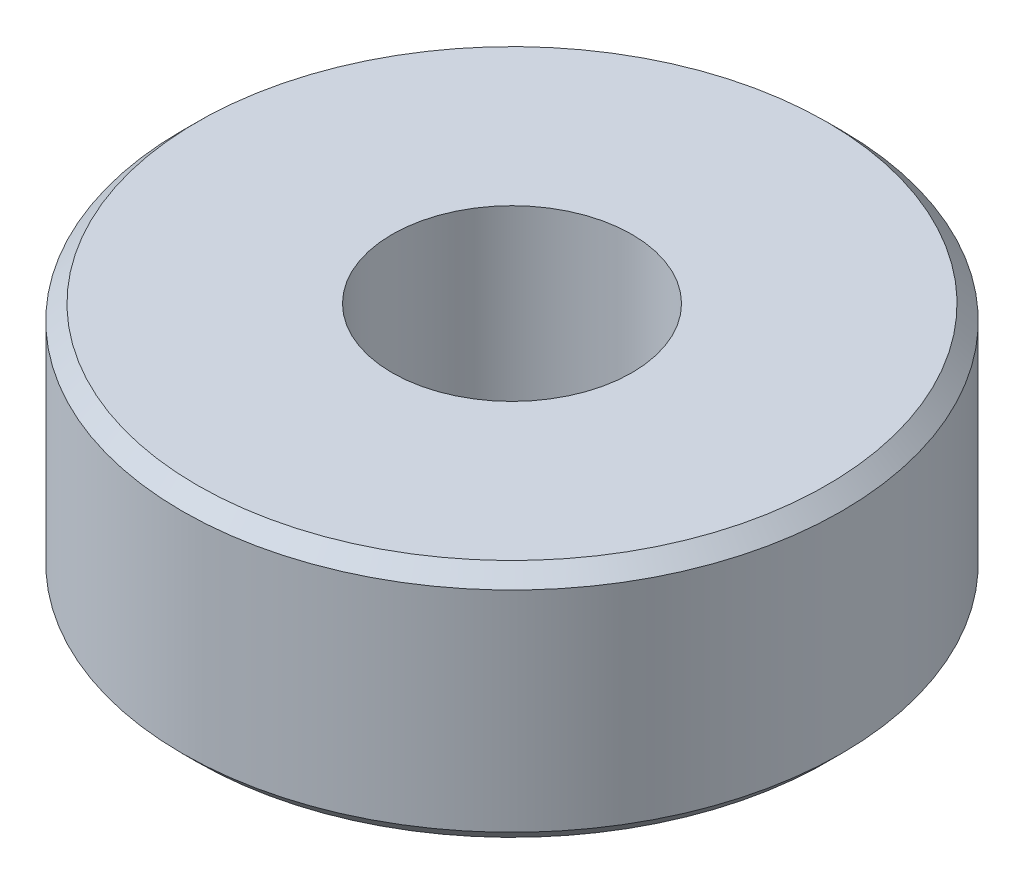
ISO-10303-21;
HEADER;
FILE_DESCRIPTION(('STEP AP214'),'2;1');
FILE_NAME('part.step','',(''),(''),'','','');
FILE_SCHEMA(('AUTOMOTIVE_DESIGN { 1 0 10303 214 1 1 1 1 }'));
ENDSEC;
DATA;
#1=APPLICATION_CONTEXT('core data for automotive mechanical design processes');
#2=APPLICATION_PROTOCOL_DEFINITION('international standard','automotive_design',2000,#1);
#3=PRODUCT_CONTEXT('',#1,'mechanical');
#4=PRODUCT('Part','Part','',(#3));
#5=PRODUCT_RELATED_PRODUCT_CATEGORY('part','',(#4));
#6=PRODUCT_DEFINITION_FORMATION('','',#4);
#7=PRODUCT_DEFINITION_CONTEXT('part definition',#1,'design');
#8=PRODUCT_DEFINITION('design','',#6,#7);
#9=PRODUCT_DEFINITION_SHAPE('','',#8);
#10=(LENGTH_UNIT() NAMED_UNIT(*) SI_UNIT(.MILLI.,.METRE.));
#11=(NAMED_UNIT(*) PLANE_ANGLE_UNIT() SI_UNIT($,.RADIAN.));
#12=(NAMED_UNIT(*) SI_UNIT($,.STERADIAN.) SOLID_ANGLE_UNIT());
#13=UNCERTAINTY_MEASURE_WITH_UNIT(LENGTH_MEASURE(1.E-05),#10,'distance_accuracy_value','');
#14=(GEOMETRIC_REPRESENTATION_CONTEXT(3) GLOBAL_UNCERTAINTY_ASSIGNED_CONTEXT((#13)) GLOBAL_UNIT_ASSIGNED_CONTEXT((#10,
#11,#12)) REPRESENTATION_CONTEXT('',''));
#15=CARTESIAN_POINT('',(0.,0.,0.));
#16=DIRECTION('',(0.,0.,1.));
#17=DIRECTION('',(1.,0.,0.));
#18=AXIS2_PLACEMENT_3D('',#15,#16,#17);
#19=CARTESIAN_POINT('',(0.,8.,0.));
#20=DIRECTION('',(0.,1.,0.));
#21=DIRECTION('',(0.,0.,1.));
#22=AXIS2_PLACEMENT_3D('',#19,#20,#21);
#23=PLANE('',#22);
#24=CARTESIAN_POINT('',(0.,8.,0.));
#25=DIRECTION('',(0.,1.,0.));
#26=DIRECTION('',(0.,0.,1.));
#27=AXIS2_PLACEMENT_3D('',#24,#25,#26);
#28=CIRCLE('',#27,10.5);
#29=CARTESIAN_POINT('',(0.,8.,10.5));
#30=VERTEX_POINT('',#29);
#31=EDGE_CURVE('E70',#30,#30,#28,.T.);
#32=ORIENTED_EDGE('',*,*,#31,.T.);
#33=EDGE_LOOP('',(#32));
#34=FACE_BOUND('',#33,.T.);
#35=CARTESIAN_POINT('',(0.,8.,0.));
#36=DIRECTION('',(0.,1.,0.));
#37=DIRECTION('',(0.,0.,1.));
#38=AXIS2_PLACEMENT_3D('',#35,#36,#37);
#39=CIRCLE('',#38,4.);
#40=CARTESIAN_POINT('',(0.,8.,4.));
#41=VERTEX_POINT('',#40);
#42=EDGE_CURVE('E74',#41,#41,#39,.T.);
#43=ORIENTED_EDGE('',*,*,#42,.F.);
#44=EDGE_LOOP('',(#43));
#45=FACE_BOUND('',#44,.T.);
#46=ADVANCED_FACE('F41',(#34,#45),#23,.T.);
#47=CARTESIAN_POINT('',(0.,0.,0.));
#48=DIRECTION('',(0.,1.,0.));
#49=DIRECTION('',(0.,0.,1.));
#50=AXIS2_PLACEMENT_3D('',#47,#48,#49);
#51=PLANE('',#50);
#52=CARTESIAN_POINT('',(0.,0.,0.));
#53=DIRECTION('',(0.,1.,0.));
#54=DIRECTION('',(0.,0.,1.));
#55=AXIS2_PLACEMENT_3D('',#52,#53,#54);
#56=CIRCLE('',#55,4.5);
#57=CARTESIAN_POINT('',(0.,0.,4.5));
#58=VERTEX_POINT('',#57);
#59=EDGE_CURVE('E50',#58,#58,#56,.T.);
#60=ORIENTED_EDGE('',*,*,#59,.T.);
#61=EDGE_LOOP('',(#60));
#62=FACE_BOUND('',#61,.T.);
#63=CARTESIAN_POINT('',(0.,0.,0.));
#64=DIRECTION('',(0.,1.,0.));
#65=DIRECTION('',(0.,0.,1.));
#66=AXIS2_PLACEMENT_3D('',#63,#64,#65);
#67=CIRCLE('',#66,10.5);
#68=CARTESIAN_POINT('',(0.,0.,10.5));
#69=VERTEX_POINT('',#68);
#70=EDGE_CURVE('E55',#69,#69,#67,.F.);
#71=ORIENTED_EDGE('',*,*,#70,.T.);
#72=EDGE_LOOP('',(#71));
#73=FACE_BOUND('',#72,.T.);
#74=ADVANCED_FACE('F82',(#62,#73),#51,.F.);
#75=CARTESIAN_POINT('',(0.,8.,0.));
#76=DIRECTION('',(0.,-1.,0.));
#77=DIRECTION('',(0.,0.,-1.));
#78=AXIS2_PLACEMENT_3D('',#75,#76,#77);
#79=CYLINDRICAL_SURFACE('',#78,11.);
#80=CARTESIAN_POINT('',(0.,7.49999999999999,0.));
#81=DIRECTION('',(0.,1.,0.));
#82=DIRECTION('',(0.,0.,1.));
#83=AXIS2_PLACEMENT_3D('',#80,#81,#82);
#84=CIRCLE('',#83,11.);
#85=CARTESIAN_POINT('',(0.,7.49999999999999,11.));
#86=VERTEX_POINT('',#85);
#87=EDGE_CURVE('E60',#86,#86,#84,.F.);
#88=ORIENTED_EDGE('',*,*,#87,.T.);
#89=EDGE_LOOP('',(#88));
#90=FACE_BOUND('',#89,.T.);
#91=CARTESIAN_POINT('',(0.,0.5,0.));
#92=DIRECTION('',(0.,1.,0.));
#93=DIRECTION('',(0.,0.,1.));
#94=AXIS2_PLACEMENT_3D('',#91,#92,#93);
#95=CIRCLE('',#94,11.);
#96=CARTESIAN_POINT('',(0.,0.5,11.));
#97=VERTEX_POINT('',#96);
#98=EDGE_CURVE('E66',#97,#97,#95,.T.);
#99=ORIENTED_EDGE('',*,*,#98,.T.);
#100=EDGE_LOOP('',(#99));
#101=FACE_BOUND('',#100,.T.);
#102=ADVANCED_FACE('F88',(#90,#101),#79,.T.);
#103=CARTESIAN_POINT('',(0.,8.,0.));
#104=DIRECTION('',(0.,-1.,0.));
#105=DIRECTION('',(0.,0.,-1.));
#106=AXIS2_PLACEMENT_3D('',#103,#104,#105);
#107=CYLINDRICAL_SURFACE('',#106,4.);
#108=CARTESIAN_POINT('',(0.,0.500000000000011,0.));
#109=DIRECTION('',(0.,1.,0.));
#110=DIRECTION('',(0.,0.,1.));
#111=AXIS2_PLACEMENT_3D('',#108,#109,#110);
#112=CIRCLE('',#111,4.);
#113=CARTESIAN_POINT('',(0.,0.500000000000011,4.));
#114=VERTEX_POINT('',#113);
#115=EDGE_CURVE('E10',#114,#114,#112,.F.);
#116=ORIENTED_EDGE('',*,*,#115,.T.);
#117=EDGE_LOOP('',(#116));
#118=FACE_BOUND('',#117,.T.);
#119=ORIENTED_EDGE('',*,*,#42,.T.);
#120=EDGE_LOOP('',(#119));
#121=FACE_BOUND('',#120,.T.);
#122=ADVANCED_FACE('F79',(#118,#121),#107,.F.);
#123=CARTESIAN_POINT('',(0.,8.,0.));
#124=DIRECTION('',(0.,-1.,0.));
#125=DIRECTION('',(0.,0.,-1.));
#126=AXIS2_PLACEMENT_3D('',#123,#124,#125);
#127=CONICAL_SURFACE('',#126,10.5,0.785398163397438);
#128=ORIENTED_EDGE('',*,*,#87,.F.);
#129=EDGE_LOOP('',(#128));
#130=FACE_BOUND('',#129,.T.);
#131=ORIENTED_EDGE('',*,*,#31,.F.);
#132=EDGE_LOOP('',(#131));
#133=FACE_BOUND('',#132,.T.);
#134=ADVANCED_FACE('F96',(#130,#133),#127,.T.);
#135=CARTESIAN_POINT('',(0.,0.,0.));
#136=DIRECTION('',(0.,-1.,0.));
#137=DIRECTION('',(0.,0.,-1.));
#138=AXIS2_PLACEMENT_3D('',#135,#136,#137);
#139=CONICAL_SURFACE('',#138,4.5,0.785398163397441);
#140=ORIENTED_EDGE('',*,*,#115,.F.);
#141=EDGE_LOOP('',(#140));
#142=FACE_BOUND('',#141,.T.);
#143=ORIENTED_EDGE('',*,*,#59,.F.);
#144=EDGE_LOOP('',(#143));
#145=FACE_BOUND('',#144,.T.);
#146=ADVANCED_FACE('F101',(#142,#145),#139,.F.);
#147=CARTESIAN_POINT('',(0.,0.5,0.));
#148=DIRECTION('',(0.,1.,0.));
#149=DIRECTION('',(0.,0.,1.));
#150=AXIS2_PLACEMENT_3D('',#147,#148,#149);
#151=CONICAL_SURFACE('',#150,11.,0.785398163397452);
#152=ORIENTED_EDGE('',*,*,#70,.F.);
#153=EDGE_LOOP('',(#152));
#154=FACE_BOUND('',#153,.T.);
#155=ORIENTED_EDGE('',*,*,#98,.F.);
#156=EDGE_LOOP('',(#155));
#157=FACE_BOUND('',#156,.T.);
#158=ADVANCED_FACE('F44',(#154,#157),#151,.T.);
#159=CLOSED_SHELL('',(#46,#74,#102,#122,#134,#146,#158));
#160=MANIFOLD_SOLID_BREP('B2',#159);
#161=ADVANCED_BREP_SHAPE_REPRESENTATION('',(#18,#160),#14);
#162=SHAPE_DEFINITION_REPRESENTATION(#9,#161);
ENDSEC;
END-ISO-10303-21;
